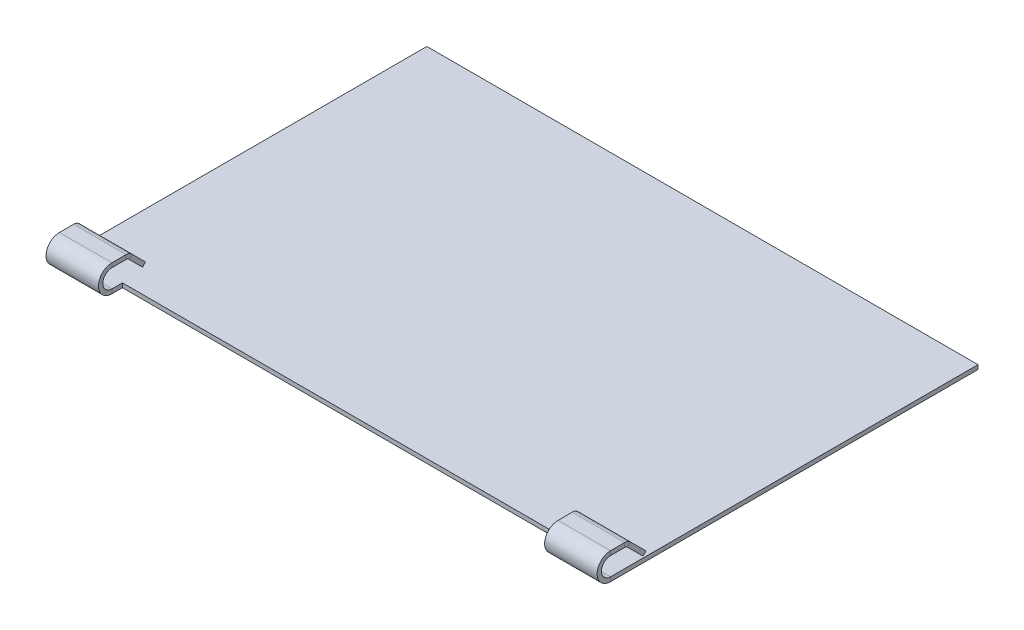
ISO-10303-21;
HEADER;
FILE_DESCRIPTION(('STEP AP214'),'2;1');
FILE_NAME('part.step','',(''),(''),'','','');
FILE_SCHEMA(('AUTOMOTIVE_DESIGN { 1 0 10303 214 1 1 1 1 }'));
ENDSEC;
DATA;
#1=APPLICATION_CONTEXT('core data for automotive mechanical design processes');
#2=APPLICATION_PROTOCOL_DEFINITION('international standard','automotive_design',2000,#1);
#3=PRODUCT_CONTEXT('',#1,'mechanical');
#4=PRODUCT('Part','Part','',(#3));
#5=PRODUCT_RELATED_PRODUCT_CATEGORY('part','',(#4));
#6=PRODUCT_DEFINITION_FORMATION('','',#4);
#7=PRODUCT_DEFINITION_CONTEXT('part definition',#1,'design');
#8=PRODUCT_DEFINITION('design','',#6,#7);
#9=PRODUCT_DEFINITION_SHAPE('','',#8);
#10=(LENGTH_UNIT() NAMED_UNIT(*) SI_UNIT(.MILLI.,.METRE.));
#11=(NAMED_UNIT(*) PLANE_ANGLE_UNIT() SI_UNIT($,.RADIAN.));
#12=(NAMED_UNIT(*) SI_UNIT($,.STERADIAN.) SOLID_ANGLE_UNIT());
#13=UNCERTAINTY_MEASURE_WITH_UNIT(LENGTH_MEASURE(1.E-05),#10,'distance_accuracy_value','');
#14=(GEOMETRIC_REPRESENTATION_CONTEXT(3) GLOBAL_UNCERTAINTY_ASSIGNED_CONTEXT((#13)) GLOBAL_UNIT_ASSIGNED_CONTEXT((#10,
#11,#12)) REPRESENTATION_CONTEXT('',''));
#15=CARTESIAN_POINT('',(0.,0.,0.));
#16=DIRECTION('',(0.,0.,1.));
#17=DIRECTION('',(1.,0.,0.));
#18=AXIS2_PLACEMENT_3D('',#15,#16,#17);
#19=CARTESIAN_POINT('',(0.,-0.81,0.));
#20=DIRECTION('',(-1.,0.,0.));
#21=DIRECTION('',(0.,0.,1.));
#22=AXIS2_PLACEMENT_3D('',#19,#20,#21);
#23=PLANE('',#22);
#24=DIRECTION('',(0.,0.,1.));
#25=VECTOR('',#24,1.);
#26=CARTESIAN_POINT('',(0.,0.,0.));
#27=LINE('',#26,#25);
#28=CARTESIAN_POINT('',(0.,0.,-70.));
#29=VERTEX_POINT('',#28);
#30=CARTESIAN_POINT('',(0.,0.,0.));
#31=VERTEX_POINT('',#30);
#32=EDGE_CURVE('E420',#29,#31,#27,.T.);
#33=ORIENTED_EDGE('',*,*,#32,.F.);
#34=DIRECTION('',(0.,1.,0.));
#35=VECTOR('',#34,1.);
#36=CARTESIAN_POINT('',(0.,-0.81,-70.));
#37=LINE('',#36,#35);
#38=CARTESIAN_POINT('',(0.,-0.81,-70.));
#39=VERTEX_POINT('',#38);
#40=EDGE_CURVE('E12',#39,#29,#37,.T.);
#41=ORIENTED_EDGE('',*,*,#40,.F.);
#42=DIRECTION('',(0.,0.,1.));
#43=VECTOR('',#42,1.);
#44=CARTESIAN_POINT('',(0.,-0.81,0.));
#45=LINE('',#44,#43);
#46=CARTESIAN_POINT('',(0.,-0.81,0.));
#47=VERTEX_POINT('',#46);
#48=EDGE_CURVE('E427',#39,#47,#45,.T.);
#49=ORIENTED_EDGE('',*,*,#48,.T.);
#50=DIRECTION('',(0.,1.,0.));
#51=VECTOR('',#50,1.);
#52=CARTESIAN_POINT('',(0.,-0.81,0.));
#53=LINE('',#52,#51);
#54=EDGE_CURVE('E45',#47,#31,#53,.T.);
#55=ORIENTED_EDGE('',*,*,#54,.T.);
#56=EDGE_LOOP('',(#33,#41,#49,#55));
#57=FACE_BOUND('',#56,.T.);
#58=ADVANCED_FACE('F42',(#57),#23,.T.);
#59=CARTESIAN_POINT('',(0.,-0.81,-70.));
#60=DIRECTION('',(0.,0.,-1.));
#61=DIRECTION('',(-1.,0.,0.));
#62=AXIS2_PLACEMENT_3D('',#59,#60,#61);
#63=PLANE('',#62);
#64=DIRECTION('',(-1.,0.,0.));
#65=VECTOR('',#64,1.);
#66=CARTESIAN_POINT('',(0.,0.,-70.));
#67=LINE('',#66,#65);
#68=CARTESIAN_POINT('',(105.,0.,-70.));
#69=VERTEX_POINT('',#68);
#70=EDGE_CURVE('E430',#69,#29,#67,.T.);
#71=ORIENTED_EDGE('',*,*,#70,.F.);
#72=DIRECTION('',(0.,1.,0.));
#73=VECTOR('',#72,1.);
#74=CARTESIAN_POINT('',(105.,-0.81,-70.));
#75=LINE('',#74,#73);
#76=CARTESIAN_POINT('',(105.,-0.81,-70.));
#77=VERTEX_POINT('',#76);
#78=EDGE_CURVE('E50',#77,#69,#75,.T.);
#79=ORIENTED_EDGE('',*,*,#78,.F.);
#80=DIRECTION('',(-1.,0.,0.));
#81=VECTOR('',#80,1.);
#82=CARTESIAN_POINT('',(0.,-0.81,-70.));
#83=LINE('',#82,#81);
#84=EDGE_CURVE('E435',#77,#39,#83,.T.);
#85=ORIENTED_EDGE('',*,*,#84,.T.);
#86=ORIENTED_EDGE('',*,*,#40,.T.);
#87=EDGE_LOOP('',(#71,#79,#85,#86));
#88=FACE_BOUND('',#87,.T.);
#89=ADVANCED_FACE('F501',(#88),#63,.T.);
#90=CARTESIAN_POINT('',(105.,-0.81,0.));
#91=DIRECTION('',(1.,0.,0.));
#92=DIRECTION('',(0.,0.,-1.));
#93=AXIS2_PLACEMENT_3D('',#90,#91,#92);
#94=PLANE('',#93);
#95=DIRECTION('',(0.,0.,-1.));
#96=VECTOR('',#95,1.);
#97=CARTESIAN_POINT('',(105.,0.,0.));
#98=LINE('',#97,#96);
#99=CARTESIAN_POINT('',(105.,0.,0.));
#100=VERTEX_POINT('',#99);
#101=EDGE_CURVE('E442',#100,#69,#98,.T.);
#102=ORIENTED_EDGE('',*,*,#101,.F.);
#103=DIRECTION('',(0.,1.,0.));
#104=VECTOR('',#103,1.);
#105=CARTESIAN_POINT('',(105.,-0.81,0.));
#106=LINE('',#105,#104);
#107=CARTESIAN_POINT('',(105.,-0.81,0.));
#108=VERTEX_POINT('',#107);
#109=EDGE_CURVE('E447',#108,#100,#106,.T.);
#110=ORIENTED_EDGE('',*,*,#109,.F.);
#111=DIRECTION('',(0.,0.,-1.));
#112=VECTOR('',#111,1.);
#113=CARTESIAN_POINT('',(105.,-0.81,0.));
#114=LINE('',#113,#112);
#115=EDGE_CURVE('E432',#108,#77,#114,.T.);
#116=ORIENTED_EDGE('',*,*,#115,.T.);
#117=ORIENTED_EDGE('',*,*,#78,.T.);
#118=EDGE_LOOP('',(#102,#110,#116,#117));
#119=FACE_BOUND('',#118,.T.);
#120=ADVANCED_FACE('F505',(#119),#94,.T.);
#121=CARTESIAN_POINT('',(0.,-0.81,0.));
#122=DIRECTION('',(0.,-1.,0.));
#123=DIRECTION('',(0.,0.,-1.));
#124=AXIS2_PLACEMENT_3D('',#121,#122,#123);
#125=PLANE('',#124);
#126=DIRECTION('',(0.,0.,1.));
#127=VECTOR('',#126,1.);
#128=CARTESIAN_POINT('',(10.,-0.81,0.));
#129=LINE('',#128,#127);
#130=CARTESIAN_POINT('',(10.,-0.81,-2.));
#131=VERTEX_POINT('',#130);
#132=CARTESIAN_POINT('',(10.,-0.81,0.));
#133=VERTEX_POINT('',#132);
#134=EDGE_CURVE('E406',#131,#133,#129,.T.);
#135=ORIENTED_EDGE('',*,*,#134,.T.);
#136=DIRECTION('',(1.,0.,0.));
#137=VECTOR('',#136,1.);
#138=CARTESIAN_POINT('',(0.,-0.81,0.));
#139=LINE('',#138,#137);
#140=EDGE_CURVE('E86',#47,#133,#139,.T.);
#141=ORIENTED_EDGE('',*,*,#140,.F.);
#142=ORIENTED_EDGE('',*,*,#48,.F.);
#143=ORIENTED_EDGE('',*,*,#84,.F.);
#144=ORIENTED_EDGE('',*,*,#115,.F.);
#145=CARTESIAN_POINT('',(95.,-0.81,0.));
#146=VERTEX_POINT('',#145);
#147=EDGE_CURVE('E429',#146,#108,#139,.T.);
#148=ORIENTED_EDGE('',*,*,#147,.F.);
#149=DIRECTION('',(0.,0.,-1.));
#150=VECTOR('',#149,1.);
#151=CARTESIAN_POINT('',(95.,-0.81,0.));
#152=LINE('',#151,#150);
#153=CARTESIAN_POINT('',(95.,-0.81,-2.));
#154=VERTEX_POINT('',#153);
#155=EDGE_CURVE('E400',#146,#154,#152,.T.);
#156=ORIENTED_EDGE('',*,*,#155,.T.);
#157=DIRECTION('',(-1.,0.,0.));
#158=VECTOR('',#157,1.);
#159=CARTESIAN_POINT('',(10.,-0.81,-2.));
#160=LINE('',#159,#158);
#161=EDGE_CURVE('E403',#154,#131,#160,.T.);
#162=ORIENTED_EDGE('',*,*,#161,.T.);
#163=EDGE_LOOP('',(#135,#141,#142,#143,#144,#148,#156,#162));
#164=FACE_BOUND('',#163,.T.);
#165=ADVANCED_FACE('F510',(#164),#125,.T.);
#166=CARTESIAN_POINT('',(0.,0.,0.));
#167=DIRECTION('',(0.,-1.,0.));
#168=DIRECTION('',(0.,0.,-1.));
#169=AXIS2_PLACEMENT_3D('',#166,#167,#168);
#170=PLANE('',#169);
#171=DIRECTION('',(1.,0.,0.));
#172=VECTOR('',#171,1.);
#173=CARTESIAN_POINT('',(0.,0.,0.));
#174=LINE('',#173,#172);
#175=CARTESIAN_POINT('',(10.,0.,0.));
#176=VERTEX_POINT('',#175);
#177=EDGE_CURVE('E440',#31,#176,#174,.T.);
#178=ORIENTED_EDGE('',*,*,#177,.T.);
#179=DIRECTION('',(0.,0.,1.));
#180=VECTOR('',#179,1.);
#181=CARTESIAN_POINT('',(10.,0.,0.));
#182=LINE('',#181,#180);
#183=CARTESIAN_POINT('',(10.,0.,-2.));
#184=VERTEX_POINT('',#183);
#185=EDGE_CURVE('E408',#184,#176,#182,.T.);
#186=ORIENTED_EDGE('',*,*,#185,.F.);
#187=DIRECTION('',(-1.,0.,0.));
#188=VECTOR('',#187,1.);
#189=CARTESIAN_POINT('',(10.,0.,-2.));
#190=LINE('',#189,#188);
#191=CARTESIAN_POINT('',(95.,0.,-2.));
#192=VERTEX_POINT('',#191);
#193=EDGE_CURVE('E414',#192,#184,#190,.T.);
#194=ORIENTED_EDGE('',*,*,#193,.F.);
#195=DIRECTION('',(0.,0.,-1.));
#196=VECTOR('',#195,1.);
#197=CARTESIAN_POINT('',(95.,0.,0.));
#198=LINE('',#197,#196);
#199=CARTESIAN_POINT('',(95.,0.,0.));
#200=VERTEX_POINT('',#199);
#201=EDGE_CURVE('E411',#200,#192,#198,.T.);
#202=ORIENTED_EDGE('',*,*,#201,.F.);
#203=EDGE_CURVE('E439',#200,#100,#174,.T.);
#204=ORIENTED_EDGE('',*,*,#203,.T.);
#205=ORIENTED_EDGE('',*,*,#101,.T.);
#206=ORIENTED_EDGE('',*,*,#70,.T.);
#207=ORIENTED_EDGE('',*,*,#32,.T.);
#208=EDGE_LOOP('',(#178,#186,#194,#202,#204,#205,#206,#207));
#209=FACE_BOUND('',#208,.T.);
#210=ADVANCED_FACE('F457',(#209),#170,.F.);
#211=CARTESIAN_POINT('',(10.,-0.811,0.));
#212=DIRECTION('',(-1.,0.,0.));
#213=DIRECTION('',(0.,0.,1.));
#214=AXIS2_PLACEMENT_3D('',#211,#212,#213);
#215=PLANE('',#214);
#216=DIRECTION('',(0.,1.,0.));
#217=VECTOR('',#216,1.);
#218=CARTESIAN_POINT('',(10.,-0.811,-2.));
#219=LINE('',#218,#217);
#220=EDGE_CURVE('E418',#131,#184,#219,.T.);
#221=ORIENTED_EDGE('',*,*,#220,.T.);
#222=ORIENTED_EDGE('',*,*,#185,.T.);
#223=DIRECTION('',(0.,1.,0.));
#224=VECTOR('',#223,1.);
#225=CARTESIAN_POINT('',(10.,-0.811,0.));
#226=LINE('',#225,#224);
#227=EDGE_CURVE('E417',#133,#176,#226,.T.);
#228=ORIENTED_EDGE('',*,*,#227,.F.);
#229=ORIENTED_EDGE('',*,*,#134,.F.);
#230=EDGE_LOOP('',(#221,#222,#228,#229));
#231=FACE_BOUND('',#230,.T.);
#232=ADVANCED_FACE('F515',(#231),#215,.F.);
#233=CARTESIAN_POINT('',(10.,-0.811,-2.));
#234=DIRECTION('',(0.,0.,-1.));
#235=DIRECTION('',(-1.,0.,0.));
#236=AXIS2_PLACEMENT_3D('',#233,#234,#235);
#237=PLANE('',#236);
#238=DIRECTION('',(0.,1.,0.));
#239=VECTOR('',#238,1.);
#240=CARTESIAN_POINT('',(95.,-0.811,-2.));
#241=LINE('',#240,#239);
#242=EDGE_CURVE('E421',#154,#192,#241,.T.);
#243=ORIENTED_EDGE('',*,*,#242,.T.);
#244=ORIENTED_EDGE('',*,*,#193,.T.);
#245=ORIENTED_EDGE('',*,*,#220,.F.);
#246=ORIENTED_EDGE('',*,*,#161,.F.);
#247=EDGE_LOOP('',(#243,#244,#245,#246));
#248=FACE_BOUND('',#247,.T.);
#249=ADVANCED_FACE('F520',(#248),#237,.F.);
#250=CARTESIAN_POINT('',(95.,-0.811,0.));
#251=DIRECTION('',(1.,0.,0.));
#252=DIRECTION('',(0.,0.,-1.));
#253=AXIS2_PLACEMENT_3D('',#250,#251,#252);
#254=PLANE('',#253);
#255=DIRECTION('',(0.,1.,0.));
#256=VECTOR('',#255,1.);
#257=CARTESIAN_POINT('',(95.,-0.811,0.));
#258=LINE('',#257,#256);
#259=EDGE_CURVE('E423',#146,#200,#258,.T.);
#260=ORIENTED_EDGE('',*,*,#259,.T.);
#261=ORIENTED_EDGE('',*,*,#201,.T.);
#262=ORIENTED_EDGE('',*,*,#242,.F.);
#263=ORIENTED_EDGE('',*,*,#155,.F.);
#264=EDGE_LOOP('',(#260,#261,#262,#263));
#265=FACE_BOUND('',#264,.T.);
#266=ADVANCED_FACE('F522',(#265),#254,.F.);
#267=CARTESIAN_POINT('',(105.,1.75,0.));
#268=DIRECTION('',(1.,0.,0.));
#269=DIRECTION('',(0.,0.,-1.));
#270=AXIS2_PLACEMENT_3D('',#267,#268,#269);
#271=PLANE('',#270);
#272=ORIENTED_EDGE('',*,*,#109,.T.);
#273=CARTESIAN_POINT('',(105.,1.75,0.));
#274=DIRECTION('',(-1.,0.,0.));
#275=DIRECTION('',(0.,0.,1.));
#276=AXIS2_PLACEMENT_3D('',#273,#274,#275);
#277=CIRCLE('',#276,1.75);
#278=CARTESIAN_POINT('',(105.,3.5,0.));
#279=VERTEX_POINT('',#278);
#280=EDGE_CURVE('E360',#100,#279,#277,.T.);
#281=ORIENTED_EDGE('',*,*,#280,.T.);
#282=DIRECTION('',(0.,1.,0.));
#283=VECTOR('',#282,1.);
#284=CARTESIAN_POINT('',(105.,3.5,0.));
#285=LINE('',#284,#283);
#286=CARTESIAN_POINT('',(105.,4.31,0.));
#287=VERTEX_POINT('',#286);
#288=EDGE_CURVE('E398',#279,#287,#285,.T.);
#289=ORIENTED_EDGE('',*,*,#288,.T.);
#290=CARTESIAN_POINT('',(105.,1.75,0.));
#291=DIRECTION('',(-1.,0.,0.));
#292=DIRECTION('',(0.,0.,1.));
#293=AXIS2_PLACEMENT_3D('',#290,#291,#292);
#294=CIRCLE('',#293,2.56);
#295=EDGE_CURVE('E341',#108,#287,#294,.T.);
#296=ORIENTED_EDGE('',*,*,#295,.F.);
#297=EDGE_LOOP('',(#272,#281,#289,#296));
#298=FACE_BOUND('',#297,.T.);
#299=ADVANCED_FACE('F525',(#298),#271,.T.);
#300=CARTESIAN_POINT('',(105.,3.5,0.));
#301=DIRECTION('',(1.,0.,0.));
#302=DIRECTION('',(0.,0.,-1.));
#303=AXIS2_PLACEMENT_3D('',#300,#301,#302);
#304=PLANE('',#303);
#305=ORIENTED_EDGE('',*,*,#288,.F.);
#306=DIRECTION('',(0.,0.,-1.));
#307=VECTOR('',#306,1.);
#308=CARTESIAN_POINT('',(105.,3.5,0.));
#309=LINE('',#308,#307);
#310=CARTESIAN_POINT('',(105.,3.5,-2.69489028995598));
#311=VERTEX_POINT('',#310);
#312=EDGE_CURVE('E363',#279,#311,#309,.T.);
#313=ORIENTED_EDGE('',*,*,#312,.T.);
#314=DIRECTION('',(0.,1.,0.));
#315=VECTOR('',#314,1.);
#316=CARTESIAN_POINT('',(105.,3.5,-2.69489028995598));
#317=LINE('',#316,#315);
#318=CARTESIAN_POINT('',(105.,4.31,-2.69489028995598));
#319=VERTEX_POINT('',#318);
#320=EDGE_CURVE('E396',#311,#319,#317,.T.);
#321=ORIENTED_EDGE('',*,*,#320,.T.);
#322=DIRECTION('',(0.,0.,1.));
#323=VECTOR('',#322,1.);
#324=CARTESIAN_POINT('',(105.,4.31,0.));
#325=LINE('',#324,#323);
#326=EDGE_CURVE('E318',#287,#319,#325,.F.);
#327=ORIENTED_EDGE('',*,*,#326,.F.);
#328=EDGE_LOOP('',(#305,#313,#321,#327));
#329=FACE_BOUND('',#328,.T.);
#330=ADVANCED_FACE('F532',(#329),#304,.T.);
#331=CARTESIAN_POINT('',(105.,2.7634,-2.69489028995598));
#332=DIRECTION('',(-1.,0.,0.));
#333=DIRECTION('',(0.,-1.,0.));
#334=AXIS2_PLACEMENT_3D('',#331,#332,#333);
#335=PLANE('',#334);
#336=ORIENTED_EDGE('',*,*,#320,.F.);
#337=CARTESIAN_POINT('',(105.,2.7634,-2.69489028995598));
#338=DIRECTION('',(1.,0.,0.));
#339=DIRECTION('',(0.,1.,0.));
#340=AXIS2_PLACEMENT_3D('',#337,#338,#339);
#341=CIRCLE('',#340,0.7366);
#342=CARTESIAN_POINT('',(105.,3.28425485502201,-3.21574514497799));
#343=VERTEX_POINT('',#342);
#344=EDGE_CURVE('E371',#311,#343,#341,.F.);
#345=ORIENTED_EDGE('',*,*,#344,.T.);
#346=DIRECTION('',(0.,0.707106781186546,-0.707106781186549));
#347=VECTOR('',#346,1.);
#348=CARTESIAN_POINT('',(105.,3.28425485502201,-3.21574514497799));
#349=LINE('',#348,#347);
#350=CARTESIAN_POINT('',(105.,3.85701134778311,-3.78850163773909));
#351=VERTEX_POINT('',#350);
#352=EDGE_CURVE('E394',#343,#351,#349,.T.);
#353=ORIENTED_EDGE('',*,*,#352,.T.);
#354=CARTESIAN_POINT('',(105.,2.7634,-2.69489028995598));
#355=DIRECTION('',(-1.,0.,0.));
#356=DIRECTION('',(0.,0.,1.));
#357=AXIS2_PLACEMENT_3D('',#354,#355,#356);
#358=CIRCLE('',#357,1.5466);
#359=EDGE_CURVE('E319',#319,#351,#358,.T.);
#360=ORIENTED_EDGE('',*,*,#359,.F.);
#361=EDGE_LOOP('',(#336,#345,#353,#360));
#362=FACE_BOUND('',#361,.T.);
#363=ADVANCED_FACE('F535',(#362),#335,.F.);
#364=CARTESIAN_POINT('',(105.,3.5,-3.));
#365=DIRECTION('',(1.,0.,0.));
#366=DIRECTION('',(0.,-0.707106781186549,-0.707106781186546));
#367=AXIS2_PLACEMENT_3D('',#364,#365,#366);
#368=PLANE('',#367);
#369=ORIENTED_EDGE('',*,*,#352,.F.);
#370=DIRECTION('',(0.,-0.707106781186549,-0.707106781186546));
#371=VECTOR('',#370,1.);
#372=CARTESIAN_POINT('',(105.,3.5,-3.));
#373=LINE('',#372,#371);
#374=CARTESIAN_POINT('',(105.,0.318019484660531,-6.18198051533946));
#375=VERTEX_POINT('',#374);
#376=EDGE_CURVE('E367',#343,#375,#373,.T.);
#377=ORIENTED_EDGE('',*,*,#376,.T.);
#378=DIRECTION('',(0.,0.707106781186546,-0.707106781186549));
#379=VECTOR('',#378,1.);
#380=CARTESIAN_POINT('',(105.,0.318019484660531,-6.18198051533946));
#381=LINE('',#380,#379);
#382=CARTESIAN_POINT('',(105.,0.890775977421634,-6.75473700810056));
#383=VERTEX_POINT('',#382);
#384=EDGE_CURVE('E392',#375,#383,#381,.T.);
#385=ORIENTED_EDGE('',*,*,#384,.T.);
#386=DIRECTION('',(0.,0.707106781186549,0.707106781186546));
#387=VECTOR('',#386,1.);
#388=CARTESIAN_POINT('',(105.,4.0727564927611,-3.5727564927611));
#389=LINE('',#388,#387);
#390=EDGE_CURVE('E327',#351,#383,#389,.F.);
#391=ORIENTED_EDGE('',*,*,#390,.F.);
#392=EDGE_LOOP('',(#369,#377,#385,#391));
#393=FACE_BOUND('',#392,.T.);
#394=ADVANCED_FACE('F539',(#393),#368,.T.);
#395=CARTESIAN_POINT('',(105.,0.318019484660531,-6.18198051533946));
#396=DIRECTION('',(0.,-0.707106781186549,-0.707106781186546));
#397=DIRECTION('',(-1.,0.,0.));
#398=AXIS2_PLACEMENT_3D('',#395,#396,#397);
#399=PLANE('',#398);
#400=ORIENTED_EDGE('',*,*,#384,.F.);
#401=DIRECTION('',(-1.,0.,0.));
#402=VECTOR('',#401,1.);
#403=CARTESIAN_POINT('',(105.,0.318019484660531,-6.18198051533946));
#404=LINE('',#403,#402);
#405=CARTESIAN_POINT('',(95.,0.318019484660531,-6.18198051533946));
#406=VERTEX_POINT('',#405);
#407=EDGE_CURVE('E370',#375,#406,#404,.T.);
#408=ORIENTED_EDGE('',*,*,#407,.T.);
#409=DIRECTION('',(0.,0.707106781186546,-0.707106781186549));
#410=VECTOR('',#409,1.);
#411=CARTESIAN_POINT('',(95.,0.318019484660531,-6.18198051533946));
#412=LINE('',#411,#410);
#413=CARTESIAN_POINT('',(95.,0.890775977421634,-6.75473700810056));
#414=VERTEX_POINT('',#413);
#415=EDGE_CURVE('E390',#406,#414,#412,.T.);
#416=ORIENTED_EDGE('',*,*,#415,.T.);
#417=DIRECTION('',(1.,0.,0.));
#418=VECTOR('',#417,1.);
#419=CARTESIAN_POINT('',(105.,0.890775977421634,-6.75473700810056));
#420=LINE('',#419,#418);
#421=EDGE_CURVE('E323',#383,#414,#420,.F.);
#422=ORIENTED_EDGE('',*,*,#421,.F.);
#423=EDGE_LOOP('',(#400,#408,#416,#422));
#424=FACE_BOUND('',#423,.T.);
#425=ADVANCED_FACE('F543',(#424),#399,.T.);
#426=CARTESIAN_POINT('',(95.,3.5,-3.));
#427=DIRECTION('',(-1.,0.,0.));
#428=DIRECTION('',(0.,0.707106781186549,0.707106781186546));
#429=AXIS2_PLACEMENT_3D('',#426,#427,#428);
#430=PLANE('',#429);
#431=ORIENTED_EDGE('',*,*,#415,.F.);
#432=DIRECTION('',(0.,0.707106781186549,0.707106781186546));
#433=VECTOR('',#432,1.);
#434=CARTESIAN_POINT('',(95.,3.5,-3.));
#435=LINE('',#434,#433);
#436=CARTESIAN_POINT('',(95.,3.28425485502201,-3.21574514497799));
#437=VERTEX_POINT('',#436);
#438=EDGE_CURVE('E356',#406,#437,#435,.T.);
#439=ORIENTED_EDGE('',*,*,#438,.T.);
#440=DIRECTION('',(0.,0.707106781186546,-0.707106781186549));
#441=VECTOR('',#440,1.);
#442=CARTESIAN_POINT('',(95.,3.28425485502201,-3.21574514497799));
#443=LINE('',#442,#441);
#444=CARTESIAN_POINT('',(95.,3.85701134778311,-3.78850163773909));
#445=VERTEX_POINT('',#444);
#446=EDGE_CURVE('E388',#437,#445,#443,.T.);
#447=ORIENTED_EDGE('',*,*,#446,.T.);
#448=DIRECTION('',(0.,0.707106781186549,0.707106781186546));
#449=VECTOR('',#448,1.);
#450=CARTESIAN_POINT('',(95.,4.0727564927611,-3.5727564927611));
#451=LINE('',#450,#449);
#452=EDGE_CURVE('E338',#414,#445,#451,.T.);
#453=ORIENTED_EDGE('',*,*,#452,.F.);
#454=EDGE_LOOP('',(#431,#439,#447,#453));
#455=FACE_BOUND('',#454,.T.);
#456=ADVANCED_FACE('F547',(#455),#430,.T.);
#457=CARTESIAN_POINT('',(95.,2.7634,-2.69489028995598));
#458=DIRECTION('',(1.,0.,0.));
#459=DIRECTION('',(0.,0.,-1.));
#460=AXIS2_PLACEMENT_3D('',#457,#458,#459);
#461=PLANE('',#460);
#462=ORIENTED_EDGE('',*,*,#446,.F.);
#463=CARTESIAN_POINT('',(95.,2.7634,-2.69489028995598));
#464=DIRECTION('',(-1.,0.,0.));
#465=DIRECTION('',(0.,0.,1.));
#466=AXIS2_PLACEMENT_3D('',#463,#464,#465);
#467=CIRCLE('',#466,0.7366);
#468=CARTESIAN_POINT('',(95.,3.5,-2.69489028995598));
#469=VERTEX_POINT('',#468);
#470=EDGE_CURVE('E352',#437,#469,#467,.F.);
#471=ORIENTED_EDGE('',*,*,#470,.T.);
#472=DIRECTION('',(0.,1.,0.));
#473=VECTOR('',#472,1.);
#474=CARTESIAN_POINT('',(95.,3.5,-2.69489028995598));
#475=LINE('',#474,#473);
#476=CARTESIAN_POINT('',(95.,4.31,-2.69489028995598));
#477=VERTEX_POINT('',#476);
#478=EDGE_CURVE('E386',#469,#477,#475,.T.);
#479=ORIENTED_EDGE('',*,*,#478,.T.);
#480=CARTESIAN_POINT('',(95.,2.7634,-2.69489028995598));
#481=DIRECTION('',(-1.,0.,0.));
#482=DIRECTION('',(0.,0.,1.));
#483=AXIS2_PLACEMENT_3D('',#480,#481,#482);
#484=CIRCLE('',#483,1.5466);
#485=EDGE_CURVE('E335',#445,#477,#484,.F.);
#486=ORIENTED_EDGE('',*,*,#485,.F.);
#487=EDGE_LOOP('',(#462,#471,#479,#486));
#488=FACE_BOUND('',#487,.T.);
#489=ADVANCED_FACE('F551',(#488),#461,.F.);
#490=CARTESIAN_POINT('',(95.,3.5,0.));
#491=DIRECTION('',(-1.,0.,0.));
#492=DIRECTION('',(0.,0.,1.));
#493=AXIS2_PLACEMENT_3D('',#490,#491,#492);
#494=PLANE('',#493);
#495=ORIENTED_EDGE('',*,*,#478,.F.);
#496=DIRECTION('',(0.,0.,1.));
#497=VECTOR('',#496,1.);
#498=CARTESIAN_POINT('',(95.,3.5,0.));
#499=LINE('',#498,#497);
#500=CARTESIAN_POINT('',(95.,3.5,0.));
#501=VERTEX_POINT('',#500);
#502=EDGE_CURVE('E355',#469,#501,#499,.T.);
#503=ORIENTED_EDGE('',*,*,#502,.T.);
#504=DIRECTION('',(0.,1.,0.));
#505=VECTOR('',#504,1.);
#506=CARTESIAN_POINT('',(95.,3.5,0.));
#507=LINE('',#506,#505);
#508=CARTESIAN_POINT('',(95.,4.31,0.));
#509=VERTEX_POINT('',#508);
#510=EDGE_CURVE('E331',#501,#509,#507,.T.);
#511=ORIENTED_EDGE('',*,*,#510,.T.);
#512=DIRECTION('',(0.,0.,1.));
#513=VECTOR('',#512,1.);
#514=CARTESIAN_POINT('',(95.,4.31,0.));
#515=LINE('',#514,#513);
#516=EDGE_CURVE('E332',#477,#509,#515,.T.);
#517=ORIENTED_EDGE('',*,*,#516,.F.);
#518=EDGE_LOOP('',(#495,#503,#511,#517));
#519=FACE_BOUND('',#518,.T.);
#520=ADVANCED_FACE('F555',(#519),#494,.T.);
#521=CARTESIAN_POINT('',(95.,1.75,0.));
#522=DIRECTION('',(1.,0.,0.));
#523=DIRECTION('',(0.,0.,-1.));
#524=AXIS2_PLACEMENT_3D('',#521,#522,#523);
#525=PLANE('',#524);
#526=ORIENTED_EDGE('',*,*,#510,.F.);
#527=CARTESIAN_POINT('',(95.,1.75,0.));
#528=DIRECTION('',(-1.,0.,0.));
#529=DIRECTION('',(0.,0.,1.));
#530=AXIS2_PLACEMENT_3D('',#527,#528,#529);
#531=CIRCLE('',#530,1.75);
#532=EDGE_CURVE('E58',#501,#200,#531,.F.);
#533=ORIENTED_EDGE('',*,*,#532,.T.);
#534=ORIENTED_EDGE('',*,*,#259,.F.);
#535=CARTESIAN_POINT('',(95.,1.75,0.));
#536=DIRECTION('',(-1.,0.,0.));
#537=DIRECTION('',(0.,0.,1.));
#538=AXIS2_PLACEMENT_3D('',#535,#536,#537);
#539=CIRCLE('',#538,2.56);
#540=EDGE_CURVE('E328',#509,#146,#539,.F.);
#541=ORIENTED_EDGE('',*,*,#540,.F.);
#542=EDGE_LOOP('',(#526,#533,#534,#541));
#543=FACE_BOUND('',#542,.T.);
#544=ADVANCED_FACE('F559',(#543),#525,.F.);
#545=CARTESIAN_POINT('',(105.,1.75,0.));
#546=DIRECTION('',(-1.,0.,0.));
#547=DIRECTION('',(0.,0.,1.));
#548=AXIS2_PLACEMENT_3D('',#545,#546,#547);
#549=CYLINDRICAL_SURFACE('',#548,2.56);
#550=DIRECTION('',(-1.,0.,0.));
#551=VECTOR('',#550,1.);
#552=CARTESIAN_POINT('',(105.,4.31,0.));
#553=LINE('',#552,#551);
#554=EDGE_CURVE('E315',#287,#509,#553,.T.);
#555=ORIENTED_EDGE('',*,*,#554,.T.);
#556=ORIENTED_EDGE('',*,*,#540,.T.);
#557=ORIENTED_EDGE('',*,*,#147,.T.);
#558=ORIENTED_EDGE('',*,*,#295,.T.);
#559=EDGE_LOOP('',(#555,#556,#557,#558));
#560=FACE_BOUND('',#559,.T.);
#561=ADVANCED_FACE('F563',(#560),#549,.T.);
#562=CARTESIAN_POINT('',(105.,4.31,0.));
#563=DIRECTION('',(0.,1.,0.));
#564=DIRECTION('',(0.,0.,1.));
#565=AXIS2_PLACEMENT_3D('',#562,#563,#564);
#566=PLANE('',#565);
#567=DIRECTION('',(1.,0.,0.));
#568=VECTOR('',#567,1.);
#569=CARTESIAN_POINT('',(105.,4.31,-2.69489028995598));
#570=LINE('',#569,#568);
#571=EDGE_CURVE('E320',#319,#477,#570,.F.);
#572=ORIENTED_EDGE('',*,*,#571,.T.);
#573=ORIENTED_EDGE('',*,*,#516,.T.);
#574=ORIENTED_EDGE('',*,*,#554,.F.);
#575=ORIENTED_EDGE('',*,*,#326,.T.);
#576=EDGE_LOOP('',(#572,#573,#574,#575));
#577=FACE_BOUND('',#576,.T.);
#578=ADVANCED_FACE('F587',(#577),#566,.T.);
#579=CARTESIAN_POINT('',(105.,2.7634,-2.69489028995598));
#580=DIRECTION('',(-1.,0.,0.));
#581=DIRECTION('',(0.,0.,1.));
#582=AXIS2_PLACEMENT_3D('',#579,#580,#581);
#583=CYLINDRICAL_SURFACE('',#582,1.5466);
#584=DIRECTION('',(-1.,0.,0.));
#585=VECTOR('',#584,1.);
#586=CARTESIAN_POINT('',(105.,3.85701134778311,-3.78850163773909));
#587=LINE('',#586,#585);
#588=EDGE_CURVE('E324',#351,#445,#587,.T.);
#589=ORIENTED_EDGE('',*,*,#588,.T.);
#590=ORIENTED_EDGE('',*,*,#485,.T.);
#591=ORIENTED_EDGE('',*,*,#571,.F.);
#592=ORIENTED_EDGE('',*,*,#359,.T.);
#593=EDGE_LOOP('',(#589,#590,#591,#592));
#594=FACE_BOUND('',#593,.T.);
#595=ADVANCED_FACE('F583',(#594),#583,.T.);
#596=CARTESIAN_POINT('',(105.,4.0727564927611,-3.5727564927611));
#597=DIRECTION('',(0.,0.707106781186546,-0.707106781186549));
#598=DIRECTION('',(0.,0.707106781186549,0.707106781186546));
#599=AXIS2_PLACEMENT_3D('',#596,#597,#598);
#600=PLANE('',#599);
#601=ORIENTED_EDGE('',*,*,#421,.T.);
#602=ORIENTED_EDGE('',*,*,#452,.T.);
#603=ORIENTED_EDGE('',*,*,#588,.F.);
#604=ORIENTED_EDGE('',*,*,#390,.T.);
#605=EDGE_LOOP('',(#601,#602,#603,#604));
#606=FACE_BOUND('',#605,.T.);
#607=ADVANCED_FACE('F568',(#606),#600,.T.);
#608=CARTESIAN_POINT('',(105.,1.75,0.));
#609=DIRECTION('',(-1.,0.,0.));
#610=DIRECTION('',(0.,0.,1.));
#611=AXIS2_PLACEMENT_3D('',#608,#609,#610);
#612=CYLINDRICAL_SURFACE('',#611,1.75);
#613=DIRECTION('',(-1.,0.,0.));
#614=VECTOR('',#613,1.);
#615=CARTESIAN_POINT('',(105.,3.5,0.));
#616=LINE('',#615,#614);
#617=EDGE_CURVE('E366',#279,#501,#616,.T.);
#618=ORIENTED_EDGE('',*,*,#617,.F.);
#619=ORIENTED_EDGE('',*,*,#280,.F.);
#620=ORIENTED_EDGE('',*,*,#203,.F.);
#621=ORIENTED_EDGE('',*,*,#532,.F.);
#622=EDGE_LOOP('',(#618,#619,#620,#621));
#623=FACE_BOUND('',#622,.T.);
#624=ADVANCED_FACE('F564',(#623),#612,.F.);
#625=CARTESIAN_POINT('',(105.,3.5,0.));
#626=DIRECTION('',(0.,1.,0.));
#627=DIRECTION('',(0.,0.,1.));
#628=AXIS2_PLACEMENT_3D('',#625,#626,#627);
#629=PLANE('',#628);
#630=DIRECTION('',(-1.,0.,0.));
#631=VECTOR('',#630,1.);
#632=CARTESIAN_POINT('',(105.,3.5,-2.69489028995598));
#633=LINE('',#632,#631);
#634=EDGE_CURVE('E374',#311,#469,#633,.T.);
#635=ORIENTED_EDGE('',*,*,#634,.F.);
#636=ORIENTED_EDGE('',*,*,#312,.F.);
#637=ORIENTED_EDGE('',*,*,#617,.T.);
#638=ORIENTED_EDGE('',*,*,#502,.F.);
#639=EDGE_LOOP('',(#635,#636,#637,#638));
#640=FACE_BOUND('',#639,.T.);
#641=ADVANCED_FACE('F567',(#640),#629,.F.);
#642=CARTESIAN_POINT('',(105.,2.7634,-2.69489028995598));
#643=DIRECTION('',(-1.,0.,0.));
#644=DIRECTION('',(0.,0.,1.));
#645=AXIS2_PLACEMENT_3D('',#642,#643,#644);
#646=CYLINDRICAL_SURFACE('',#645,0.7366);
#647=DIRECTION('',(-1.,0.,0.));
#648=VECTOR('',#647,1.);
#649=CARTESIAN_POINT('',(105.,3.28425485502201,-3.21574514497799));
#650=LINE('',#649,#648);
#651=EDGE_CURVE('E314',#343,#437,#650,.T.);
#652=ORIENTED_EDGE('',*,*,#651,.F.);
#653=ORIENTED_EDGE('',*,*,#344,.F.);
#654=ORIENTED_EDGE('',*,*,#634,.T.);
#655=ORIENTED_EDGE('',*,*,#470,.F.);
#656=EDGE_LOOP('',(#652,#653,#654,#655));
#657=FACE_BOUND('',#656,.T.);
#658=ADVANCED_FACE('F572',(#657),#646,.F.);
#659=CARTESIAN_POINT('',(105.,3.5,-3.));
#660=DIRECTION('',(0.,0.707106781186546,-0.707106781186549));
#661=DIRECTION('',(0.,0.707106781186549,0.707106781186546));
#662=AXIS2_PLACEMENT_3D('',#659,#660,#661);
#663=PLANE('',#662);
#664=ORIENTED_EDGE('',*,*,#407,.F.);
#665=ORIENTED_EDGE('',*,*,#376,.F.);
#666=ORIENTED_EDGE('',*,*,#651,.T.);
#667=ORIENTED_EDGE('',*,*,#438,.F.);
#668=EDGE_LOOP('',(#664,#665,#666,#667));
#669=FACE_BOUND('',#668,.T.);
#670=ADVANCED_FACE('F576',(#669),#663,.F.);
#671=CARTESIAN_POINT('',(0.,1.75,0.));
#672=DIRECTION('',(1.,0.,0.));
#673=DIRECTION('',(0.,0.,-1.));
#674=AXIS2_PLACEMENT_3D('',#671,#672,#673);
#675=PLANE('',#674);
#676=ORIENTED_EDGE('',*,*,#54,.F.);
#677=CARTESIAN_POINT('',(0.,1.75,0.));
#678=DIRECTION('',(1.,0.,0.));
#679=DIRECTION('',(0.,0.,-1.));
#680=AXIS2_PLACEMENT_3D('',#677,#678,#679);
#681=CIRCLE('',#680,2.56);
#682=CARTESIAN_POINT('',(0.,4.31,0.));
#683=VERTEX_POINT('',#682);
#684=EDGE_CURVE('E252',#47,#683,#681,.F.);
#685=ORIENTED_EDGE('',*,*,#684,.T.);
#686=DIRECTION('',(0.,-1.,0.));
#687=VECTOR('',#686,1.);
#688=CARTESIAN_POINT('',(0.,3.5,0.));
#689=LINE('',#688,#687);
#690=CARTESIAN_POINT('',(0.,3.5,0.));
#691=VERTEX_POINT('',#690);
#692=EDGE_CURVE('E312',#691,#683,#689,.F.);
#693=ORIENTED_EDGE('',*,*,#692,.F.);
#694=CARTESIAN_POINT('',(0.,1.75,0.));
#695=DIRECTION('',(-1.,0.,0.));
#696=DIRECTION('',(0.,0.,1.));
#697=AXIS2_PLACEMENT_3D('',#694,#695,#696);
#698=CIRCLE('',#697,1.75);
#699=EDGE_CURVE('E273',#31,#691,#698,.T.);
#700=ORIENTED_EDGE('',*,*,#699,.F.);
#701=EDGE_LOOP('',(#676,#685,#693,#700));
#702=FACE_BOUND('',#701,.T.);
#703=ADVANCED_FACE('F462',(#702),#675,.F.);
#704=CARTESIAN_POINT('',(0.,3.5,0.));
#705=DIRECTION('',(-1.,0.,0.));
#706=DIRECTION('',(0.,0.,-1.));
#707=AXIS2_PLACEMENT_3D('',#704,#705,#706);
#708=PLANE('',#707);
#709=ORIENTED_EDGE('',*,*,#692,.T.);
#710=DIRECTION('',(0.,0.,-1.));
#711=VECTOR('',#710,1.);
#712=CARTESIAN_POINT('',(0.,4.31,0.));
#713=LINE('',#712,#711);
#714=CARTESIAN_POINT('',(0.,4.31,-2.69489028995598));
#715=VERTEX_POINT('',#714);
#716=EDGE_CURVE('E217',#683,#715,#713,.T.);
#717=ORIENTED_EDGE('',*,*,#716,.T.);
#718=DIRECTION('',(0.,-1.,0.));
#719=VECTOR('',#718,1.);
#720=CARTESIAN_POINT('',(0.,3.5,-2.69489028995598));
#721=LINE('',#720,#719);
#722=CARTESIAN_POINT('',(0.,3.5,-2.69489028995598));
#723=VERTEX_POINT('',#722);
#724=EDGE_CURVE('E309',#723,#715,#721,.F.);
#725=ORIENTED_EDGE('',*,*,#724,.F.);
#726=DIRECTION('',(0.,0.,-1.));
#727=VECTOR('',#726,1.);
#728=CARTESIAN_POINT('',(0.,3.5,0.));
#729=LINE('',#728,#727);
#730=EDGE_CURVE('E276',#691,#723,#729,.T.);
#731=ORIENTED_EDGE('',*,*,#730,.F.);
#732=EDGE_LOOP('',(#709,#717,#725,#731));
#733=FACE_BOUND('',#732,.T.);
#734=ADVANCED_FACE('F465',(#733),#708,.T.);
#735=CARTESIAN_POINT('',(0.,2.7634,-2.69489028995598));
#736=DIRECTION('',(-1.,0.,0.));
#737=DIRECTION('',(0.,0.,1.));
#738=AXIS2_PLACEMENT_3D('',#735,#736,#737);
#739=PLANE('',#738);
#740=ORIENTED_EDGE('',*,*,#724,.T.);
#741=CARTESIAN_POINT('',(0.,2.7634,-2.69489028995598));
#742=DIRECTION('',(1.,0.,0.));
#743=DIRECTION('',(0.,0.,-1.));
#744=AXIS2_PLACEMENT_3D('',#741,#742,#743);
#745=CIRCLE('',#744,1.5466);
#746=CARTESIAN_POINT('',(0.,3.85701134778311,-3.78850163773909));
#747=VERTEX_POINT('',#746);
#748=EDGE_CURVE('E221',#715,#747,#745,.F.);
#749=ORIENTED_EDGE('',*,*,#748,.T.);
#750=DIRECTION('',(0.,-0.707106781186546,0.707106781186549));
#751=VECTOR('',#750,1.);
#752=CARTESIAN_POINT('',(0.,3.28425485502201,-3.21574514497799));
#753=LINE('',#752,#751);
#754=CARTESIAN_POINT('',(0.,3.28425485502201,-3.21574514497799));
#755=VERTEX_POINT('',#754);
#756=EDGE_CURVE('E306',#755,#747,#753,.F.);
#757=ORIENTED_EDGE('',*,*,#756,.F.);
#758=CARTESIAN_POINT('',(0.,2.7634,-2.69489028995598));
#759=DIRECTION('',(1.,0.,0.));
#760=DIRECTION('',(0.,0.,-1.));
#761=AXIS2_PLACEMENT_3D('',#758,#759,#760);
#762=CIRCLE('',#761,0.7366);
#763=EDGE_CURVE('E285',#723,#755,#762,.F.);
#764=ORIENTED_EDGE('',*,*,#763,.F.);
#765=EDGE_LOOP('',(#740,#749,#757,#764));
#766=FACE_BOUND('',#765,.T.);
#767=ADVANCED_FACE('F490',(#766),#739,.T.);
#768=CARTESIAN_POINT('',(0.,3.5,-3.));
#769=DIRECTION('',(-1.,0.,0.));
#770=DIRECTION('',(0.,-0.707106781186549,-0.707106781186546));
#771=AXIS2_PLACEMENT_3D('',#768,#769,#770);
#772=PLANE('',#771);
#773=ORIENTED_EDGE('',*,*,#756,.T.);
#774=DIRECTION('',(0.,-0.707106781186549,-0.707106781186546));
#775=VECTOR('',#774,1.);
#776=CARTESIAN_POINT('',(0.,4.0727564927611,-3.5727564927611));
#777=LINE('',#776,#775);
#778=CARTESIAN_POINT('',(0.,1.24432936801491,-6.40118361750729));
#779=VERTEX_POINT('',#778);
#780=EDGE_CURVE('E257',#747,#779,#777,.T.);
#781=ORIENTED_EDGE('',*,*,#780,.T.);
#782=DIRECTION('',(0.,-0.707106781186546,0.707106781186549));
#783=VECTOR('',#782,1.);
#784=CARTESIAN_POINT('',(0.,0.671572875253804,-5.82842712474618));
#785=LINE('',#784,#783);
#786=CARTESIAN_POINT('',(0.,0.671572875253804,-5.82842712474618));
#787=VERTEX_POINT('',#786);
#788=EDGE_CURVE('E303',#787,#779,#785,.F.);
#789=ORIENTED_EDGE('',*,*,#788,.F.);
#790=DIRECTION('',(0.,-0.707106781186549,-0.707106781186546));
#791=VECTOR('',#790,1.);
#792=CARTESIAN_POINT('',(0.,3.5,-3.));
#793=LINE('',#792,#791);
#794=EDGE_CURVE('E280',#755,#787,#793,.T.);
#795=ORIENTED_EDGE('',*,*,#794,.F.);
#796=EDGE_LOOP('',(#773,#781,#789,#795));
#797=FACE_BOUND('',#796,.T.);
#798=ADVANCED_FACE('F488',(#797),#772,.T.);
#799=CARTESIAN_POINT('',(0.,0.671572875253804,-5.82842712474618));
#800=DIRECTION('',(0.,-0.707106781186549,-0.707106781186546));
#801=DIRECTION('',(1.,0.,0.));
#802=AXIS2_PLACEMENT_3D('',#799,#800,#801);
#803=PLANE('',#802);
#804=ORIENTED_EDGE('',*,*,#788,.T.);
#805=DIRECTION('',(1.,0.,0.));
#806=VECTOR('',#805,1.);
#807=CARTESIAN_POINT('',(0.,1.24432936801491,-6.40118361750729));
#808=LINE('',#807,#806);
#809=CARTESIAN_POINT('',(10.,1.24432936801491,-6.40118361750729));
#810=VERTEX_POINT('',#809);
#811=EDGE_CURVE('E253',#779,#810,#808,.T.);
#812=ORIENTED_EDGE('',*,*,#811,.T.);
#813=DIRECTION('',(0.,-0.707106781186546,0.707106781186549));
#814=VECTOR('',#813,1.);
#815=CARTESIAN_POINT('',(10.,0.671572875253804,-5.82842712474618));
#816=LINE('',#815,#814);
#817=CARTESIAN_POINT('',(10.,0.671572875253804,-5.82842712474618));
#818=VERTEX_POINT('',#817);
#819=EDGE_CURVE('E300',#818,#810,#816,.F.);
#820=ORIENTED_EDGE('',*,*,#819,.F.);
#821=DIRECTION('',(1.,0.,0.));
#822=VECTOR('',#821,1.);
#823=CARTESIAN_POINT('',(0.,0.671572875253804,-5.82842712474618));
#824=LINE('',#823,#822);
#825=EDGE_CURVE('E283',#787,#818,#824,.T.);
#826=ORIENTED_EDGE('',*,*,#825,.F.);
#827=EDGE_LOOP('',(#804,#812,#820,#826));
#828=FACE_BOUND('',#827,.T.);
#829=ADVANCED_FACE('F497',(#828),#803,.T.);
#830=CARTESIAN_POINT('',(10.,3.5,-3.));
#831=DIRECTION('',(1.,0.,0.));
#832=DIRECTION('',(0.,0.707106781186549,0.707106781186546));
#833=AXIS2_PLACEMENT_3D('',#830,#831,#832);
#834=PLANE('',#833);
#835=ORIENTED_EDGE('',*,*,#819,.T.);
#836=DIRECTION('',(0.,-0.707106781186549,-0.707106781186546));
#837=VECTOR('',#836,1.);
#838=CARTESIAN_POINT('',(10.,4.0727564927611,-3.5727564927611));
#839=LINE('',#838,#837);
#840=CARTESIAN_POINT('',(10.,3.85701134778311,-3.78850163773909));
#841=VERTEX_POINT('',#840);
#842=EDGE_CURVE('E246',#810,#841,#839,.F.);
#843=ORIENTED_EDGE('',*,*,#842,.T.);
#844=DIRECTION('',(0.,-0.707106781186546,0.707106781186549));
#845=VECTOR('',#844,1.);
#846=CARTESIAN_POINT('',(10.,3.28425485502201,-3.21574514497799));
#847=LINE('',#846,#845);
#848=CARTESIAN_POINT('',(10.,3.28425485502201,-3.21574514497799));
#849=VERTEX_POINT('',#848);
#850=EDGE_CURVE('E297',#849,#841,#847,.F.);
#851=ORIENTED_EDGE('',*,*,#850,.F.);
#852=DIRECTION('',(0.,0.707106781186549,0.707106781186546));
#853=VECTOR('',#852,1.);
#854=CARTESIAN_POINT('',(10.,3.5,-3.));
#855=LINE('',#854,#853);
#856=EDGE_CURVE('E270',#818,#849,#855,.T.);
#857=ORIENTED_EDGE('',*,*,#856,.F.);
#858=EDGE_LOOP('',(#835,#843,#851,#857));
#859=FACE_BOUND('',#858,.T.);
#860=ADVANCED_FACE('F627',(#859),#834,.T.);
#861=CARTESIAN_POINT('',(10.,2.7634,-2.69489028995598));
#862=DIRECTION('',(-1.,0.,0.));
#863=DIRECTION('',(0.,0.,1.));
#864=AXIS2_PLACEMENT_3D('',#861,#862,#863);
#865=PLANE('',#864);
#866=ORIENTED_EDGE('',*,*,#850,.T.);
#867=CARTESIAN_POINT('',(10.,2.7634,-2.69489028995598));
#868=DIRECTION('',(1.,0.,0.));
#869=DIRECTION('',(0.,0.,-1.));
#870=AXIS2_PLACEMENT_3D('',#867,#868,#869);
#871=CIRCLE('',#870,1.5466);
#872=CARTESIAN_POINT('',(10.,4.31,-2.69489028995598));
#873=VERTEX_POINT('',#872);
#874=EDGE_CURVE('E244',#841,#873,#871,.T.);
#875=ORIENTED_EDGE('',*,*,#874,.T.);
#876=DIRECTION('',(0.,-1.,0.));
#877=VECTOR('',#876,1.);
#878=CARTESIAN_POINT('',(10.,3.5,-2.69489028995598));
#879=LINE('',#878,#877);
#880=CARTESIAN_POINT('',(10.,3.5,-2.69489028995598));
#881=VERTEX_POINT('',#880);
#882=EDGE_CURVE('E239',#881,#873,#879,.F.);
#883=ORIENTED_EDGE('',*,*,#882,.F.);
#884=CARTESIAN_POINT('',(10.,2.7634,-2.69489028995598));
#885=DIRECTION('',(1.,0.,0.));
#886=DIRECTION('',(0.,0.,-1.));
#887=AXIS2_PLACEMENT_3D('',#884,#885,#886);
#888=CIRCLE('',#887,0.7366);
#889=EDGE_CURVE('E266',#849,#881,#888,.T.);
#890=ORIENTED_EDGE('',*,*,#889,.F.);
#891=EDGE_LOOP('',(#866,#875,#883,#890));
#892=FACE_BOUND('',#891,.T.);
#893=ADVANCED_FACE('F474',(#892),#865,.F.);
#894=CARTESIAN_POINT('',(10.,3.5,0.));
#895=DIRECTION('',(1.,0.,0.));
#896=DIRECTION('',(0.,0.,1.));
#897=AXIS2_PLACEMENT_3D('',#894,#895,#896);
#898=PLANE('',#897);
#899=ORIENTED_EDGE('',*,*,#882,.T.);
#900=DIRECTION('',(0.,0.,-1.));
#901=VECTOR('',#900,1.);
#902=CARTESIAN_POINT('',(10.,4.31,0.));
#903=LINE('',#902,#901);
#904=CARTESIAN_POINT('',(10.,4.31,0.));
#905=VERTEX_POINT('',#904);
#906=EDGE_CURVE('E214',#873,#905,#903,.F.);
#907=ORIENTED_EDGE('',*,*,#906,.T.);
#908=DIRECTION('',(0.,-1.,0.));
#909=VECTOR('',#908,1.);
#910=CARTESIAN_POINT('',(10.,3.5,0.));
#911=LINE('',#910,#909);
#912=CARTESIAN_POINT('',(10.,3.5,0.));
#913=VERTEX_POINT('',#912);
#914=EDGE_CURVE('E229',#913,#905,#911,.F.);
#915=ORIENTED_EDGE('',*,*,#914,.F.);
#916=DIRECTION('',(0.,0.,1.));
#917=VECTOR('',#916,1.);
#918=CARTESIAN_POINT('',(10.,3.5,0.));
#919=LINE('',#918,#917);
#920=EDGE_CURVE('E269',#881,#913,#919,.T.);
#921=ORIENTED_EDGE('',*,*,#920,.F.);
#922=EDGE_LOOP('',(#899,#907,#915,#921));
#923=FACE_BOUND('',#922,.T.);
#924=ADVANCED_FACE('F241',(#923),#898,.T.);
#925=CARTESIAN_POINT('',(10.,1.75,0.));
#926=DIRECTION('',(-1.,0.,0.));
#927=DIRECTION('',(0.,0.,1.));
#928=AXIS2_PLACEMENT_3D('',#925,#926,#927);
#929=PLANE('',#928);
#930=ORIENTED_EDGE('',*,*,#914,.T.);
#931=CARTESIAN_POINT('',(10.,1.75,0.));
#932=DIRECTION('',(1.,0.,0.));
#933=DIRECTION('',(0.,0.,-1.));
#934=AXIS2_PLACEMENT_3D('',#931,#932,#933);
#935=CIRCLE('',#934,2.56);
#936=EDGE_CURVE('E224',#905,#133,#935,.T.);
#937=ORIENTED_EDGE('',*,*,#936,.T.);
#938=ORIENTED_EDGE('',*,*,#227,.T.);
#939=CARTESIAN_POINT('',(10.,1.75,0.));
#940=DIRECTION('',(1.,0.,0.));
#941=DIRECTION('',(0.,0.,-1.));
#942=AXIS2_PLACEMENT_3D('',#939,#940,#941);
#943=CIRCLE('',#942,1.75);
#944=EDGE_CURVE('E235',#913,#176,#943,.T.);
#945=ORIENTED_EDGE('',*,*,#944,.F.);
#946=EDGE_LOOP('',(#930,#937,#938,#945));
#947=FACE_BOUND('',#946,.T.);
#948=ADVANCED_FACE('F233',(#947),#929,.F.);
#949=CARTESIAN_POINT('',(0.,1.75,0.));
#950=DIRECTION('',(1.,0.,0.));
#951=DIRECTION('',(0.,0.,-1.));
#952=AXIS2_PLACEMENT_3D('',#949,#950,#951);
#953=CYLINDRICAL_SURFACE('',#952,2.56);
#954=DIRECTION('',(1.,0.,0.));
#955=VECTOR('',#954,1.);
#956=CARTESIAN_POINT('',(0.,4.31,0.));
#957=LINE('',#956,#955);
#958=EDGE_CURVE('E210',#683,#905,#957,.T.);
#959=ORIENTED_EDGE('',*,*,#958,.F.);
#960=ORIENTED_EDGE('',*,*,#684,.F.);
#961=ORIENTED_EDGE('',*,*,#140,.T.);
#962=ORIENTED_EDGE('',*,*,#936,.F.);
#963=EDGE_LOOP('',(#959,#960,#961,#962));
#964=FACE_BOUND('',#963,.T.);
#965=ADVANCED_FACE('F226',(#964),#953,.T.);
#966=CARTESIAN_POINT('',(0.,4.31,0.));
#967=DIRECTION('',(0.,-1.,0.));
#968=DIRECTION('',(0.,0.,-1.));
#969=AXIS2_PLACEMENT_3D('',#966,#967,#968);
#970=PLANE('',#969);
#971=DIRECTION('',(1.,0.,0.));
#972=VECTOR('',#971,1.);
#973=CARTESIAN_POINT('',(0.,4.31,-2.69489028995598));
#974=LINE('',#973,#972);
#975=EDGE_CURVE('E256',#715,#873,#974,.T.);
#976=ORIENTED_EDGE('',*,*,#975,.F.);
#977=ORIENTED_EDGE('',*,*,#716,.F.);
#978=ORIENTED_EDGE('',*,*,#958,.T.);
#979=ORIENTED_EDGE('',*,*,#906,.F.);
#980=EDGE_LOOP('',(#976,#977,#978,#979));
#981=FACE_BOUND('',#980,.T.);
#982=ADVANCED_FACE('F212',(#981),#970,.F.);
#983=CARTESIAN_POINT('',(0.,2.7634,-2.69489028995598));
#984=DIRECTION('',(1.,0.,0.));
#985=DIRECTION('',(0.,0.,-1.));
#986=AXIS2_PLACEMENT_3D('',#983,#984,#985);
#987=CYLINDRICAL_SURFACE('',#986,1.5466);
#988=DIRECTION('',(1.,0.,0.));
#989=VECTOR('',#988,1.);
#990=CARTESIAN_POINT('',(0.,3.85701134778311,-3.78850163773909));
#991=LINE('',#990,#989);
#992=EDGE_CURVE('E260',#747,#841,#991,.T.);
#993=ORIENTED_EDGE('',*,*,#992,.F.);
#994=ORIENTED_EDGE('',*,*,#748,.F.);
#995=ORIENTED_EDGE('',*,*,#975,.T.);
#996=ORIENTED_EDGE('',*,*,#874,.F.);
#997=EDGE_LOOP('',(#993,#994,#995,#996));
#998=FACE_BOUND('',#997,.T.);
#999=ADVANCED_FACE('F478',(#998),#987,.T.);
#1000=CARTESIAN_POINT('',(0.,4.0727564927611,-3.5727564927611));
#1001=DIRECTION('',(0.,-0.707106781186546,0.707106781186549));
#1002=DIRECTION('',(0.,-0.707106781186549,-0.707106781186546));
#1003=AXIS2_PLACEMENT_3D('',#1000,#1001,#1002);
#1004=PLANE('',#1003);
#1005=ORIENTED_EDGE('',*,*,#811,.F.);
#1006=ORIENTED_EDGE('',*,*,#780,.F.);
#1007=ORIENTED_EDGE('',*,*,#992,.T.);
#1008=ORIENTED_EDGE('',*,*,#842,.F.);
#1009=EDGE_LOOP('',(#1005,#1006,#1007,#1008));
#1010=FACE_BOUND('',#1009,.T.);
#1011=ADVANCED_FACE('F483',(#1010),#1004,.F.);
#1012=CARTESIAN_POINT('',(0.,1.75,0.));
#1013=DIRECTION('',(1.,0.,0.));
#1014=DIRECTION('',(0.,0.,-1.));
#1015=AXIS2_PLACEMENT_3D('',#1012,#1013,#1014);
#1016=CYLINDRICAL_SURFACE('',#1015,1.75);
#1017=DIRECTION('',(1.,0.,0.));
#1018=VECTOR('',#1017,1.);
#1019=CARTESIAN_POINT('',(0.,3.5,0.));
#1020=LINE('',#1019,#1018);
#1021=EDGE_CURVE('E279',#691,#913,#1020,.T.);
#1022=ORIENTED_EDGE('',*,*,#1021,.T.);
#1023=ORIENTED_EDGE('',*,*,#944,.T.);
#1024=ORIENTED_EDGE('',*,*,#177,.F.);
#1025=ORIENTED_EDGE('',*,*,#699,.T.);
#1026=EDGE_LOOP('',(#1022,#1023,#1024,#1025));
#1027=FACE_BOUND('',#1026,.T.);
#1028=ADVANCED_FACE('F460',(#1027),#1016,.F.);
#1029=CARTESIAN_POINT('',(0.,3.5,0.));
#1030=DIRECTION('',(0.,-1.,0.));
#1031=DIRECTION('',(0.,0.,-1.));
#1032=AXIS2_PLACEMENT_3D('',#1029,#1030,#1031);
#1033=PLANE('',#1032);
#1034=DIRECTION('',(1.,0.,0.));
#1035=VECTOR('',#1034,1.);
#1036=CARTESIAN_POINT('',(0.,3.5,-2.69489028995598));
#1037=LINE('',#1036,#1035);
#1038=EDGE_CURVE('E288',#723,#881,#1037,.T.);
#1039=ORIENTED_EDGE('',*,*,#1038,.T.);
#1040=ORIENTED_EDGE('',*,*,#920,.T.);
#1041=ORIENTED_EDGE('',*,*,#1021,.F.);
#1042=ORIENTED_EDGE('',*,*,#730,.T.);
#1043=EDGE_LOOP('',(#1039,#1040,#1041,#1042));
#1044=FACE_BOUND('',#1043,.T.);
#1045=ADVANCED_FACE('F468',(#1044),#1033,.T.);
#1046=CARTESIAN_POINT('',(0.,2.7634,-2.69489028995598));
#1047=DIRECTION('',(1.,0.,0.));
#1048=DIRECTION('',(0.,0.,-1.));
#1049=AXIS2_PLACEMENT_3D('',#1046,#1047,#1048);
#1050=CYLINDRICAL_SURFACE('',#1049,0.7366);
#1051=DIRECTION('',(1.,0.,0.));
#1052=VECTOR('',#1051,1.);
#1053=CARTESIAN_POINT('',(0.,3.28425485502201,-3.21574514497799));
#1054=LINE('',#1053,#1052);
#1055=EDGE_CURVE('E284',#755,#849,#1054,.T.);
#1056=ORIENTED_EDGE('',*,*,#1055,.T.);
#1057=ORIENTED_EDGE('',*,*,#889,.T.);
#1058=ORIENTED_EDGE('',*,*,#1038,.F.);
#1059=ORIENTED_EDGE('',*,*,#763,.T.);
#1060=EDGE_LOOP('',(#1056,#1057,#1058,#1059));
#1061=FACE_BOUND('',#1060,.T.);
#1062=ADVANCED_FACE('F471',(#1061),#1050,.F.);
#1063=CARTESIAN_POINT('',(0.,3.5,-3.));
#1064=DIRECTION('',(0.,-0.707106781186546,0.707106781186549));
#1065=DIRECTION('',(0.,-0.707106781186549,-0.707106781186546));
#1066=AXIS2_PLACEMENT_3D('',#1063,#1064,#1065);
#1067=PLANE('',#1066);
#1068=ORIENTED_EDGE('',*,*,#825,.T.);
#1069=ORIENTED_EDGE('',*,*,#856,.T.);
#1070=ORIENTED_EDGE('',*,*,#1055,.F.);
#1071=ORIENTED_EDGE('',*,*,#794,.T.);
#1072=EDGE_LOOP('',(#1068,#1069,#1070,#1071));
#1073=FACE_BOUND('',#1072,.T.);
#1074=ADVANCED_FACE('F729',(#1073),#1067,.T.);
#1075=CLOSED_SHELL('',(#58,#89,#120,#165,#210,#232,#249,#266,#299,#330,#363,#394,#425,#456,#489,
#520,#544,#561,#578,#595,#607,#624,#641,#658,#670,#703,#734,#767,#798,#829,#860,#893,#924,#948,
#965,#982,#999,#1011,#1028,#1045,#1062,#1074));
#1076=MANIFOLD_SOLID_BREP('B2',#1075);
#1077=ADVANCED_BREP_SHAPE_REPRESENTATION('',(#18,#1076),#14);
#1078=SHAPE_DEFINITION_REPRESENTATION(#9,#1077);
ENDSEC;
END-ISO-10303-21;
